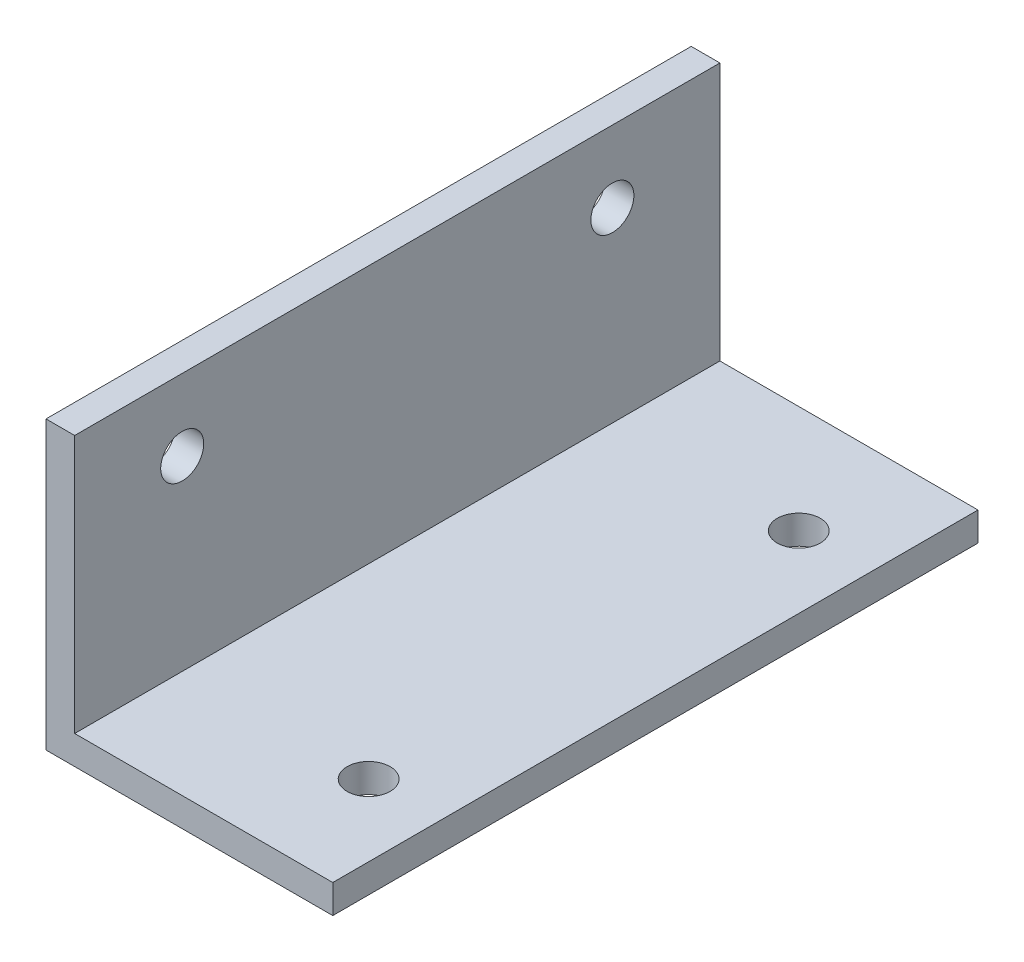
ISO-10303-21;
HEADER;
FILE_DESCRIPTION(('STEP AP214'),'2;1');
FILE_NAME('part.step','',(''),(''),'','','');
FILE_SCHEMA(('AUTOMOTIVE_DESIGN { 1 0 10303 214 1 1 1 1 }'));
ENDSEC;
DATA;
#1=APPLICATION_CONTEXT('core data for automotive mechanical design processes');
#2=APPLICATION_PROTOCOL_DEFINITION('international standard','automotive_design',2000,#1);
#3=PRODUCT_CONTEXT('',#1,'mechanical');
#4=PRODUCT('Part','Part','',(#3));
#5=PRODUCT_RELATED_PRODUCT_CATEGORY('part','',(#4));
#6=PRODUCT_DEFINITION_FORMATION('','',#4);
#7=PRODUCT_DEFINITION_CONTEXT('part definition',#1,'design');
#8=PRODUCT_DEFINITION('design','',#6,#7);
#9=PRODUCT_DEFINITION_SHAPE('','',#8);
#10=(LENGTH_UNIT() NAMED_UNIT(*) SI_UNIT(.MILLI.,.METRE.));
#11=(NAMED_UNIT(*) PLANE_ANGLE_UNIT() SI_UNIT($,.RADIAN.));
#12=(NAMED_UNIT(*) SI_UNIT($,.STERADIAN.) SOLID_ANGLE_UNIT());
#13=UNCERTAINTY_MEASURE_WITH_UNIT(LENGTH_MEASURE(1.E-05),#10,'distance_accuracy_value','');
#14=(GEOMETRIC_REPRESENTATION_CONTEXT(3) GLOBAL_UNCERTAINTY_ASSIGNED_CONTEXT((#13)) GLOBAL_UNIT_ASSIGNED_CONTEXT((#10,
#11,#12)) REPRESENTATION_CONTEXT('',''));
#15=CARTESIAN_POINT('',(0.,0.,0.));
#16=DIRECTION('',(0.,0.,1.));
#17=DIRECTION('',(1.,0.,0.));
#18=AXIS2_PLACEMENT_3D('',#15,#16,#17);
#19=CARTESIAN_POINT('',(18.,0.,45.));
#20=DIRECTION('',(0.,-1.,0.));
#21=DIRECTION('',(1.,0.,0.));
#22=AXIS2_PLACEMENT_3D('',#19,#20,#21);
#23=PLANE('',#22);
#24=CARTESIAN_POINT('',(13.,0.,37.5));
#25=DIRECTION('',(0.,1.,0.));
#26=DIRECTION('',(-1.,0.,0.));
#27=AXIS2_PLACEMENT_3D('',#24,#25,#26);
#28=CIRCLE('',#27,1.5);
#29=CARTESIAN_POINT('',(11.5,0.,37.5));
#30=VERTEX_POINT('',#29);
#31=EDGE_CURVE('E183',#30,#30,#28,.T.);
#32=ORIENTED_EDGE('',*,*,#31,.F.);
#33=EDGE_LOOP('',(#32));
#34=FACE_BOUND('',#33,.T.);
#35=CARTESIAN_POINT('',(13.,0.,7.5));
#36=DIRECTION('',(0.,1.,0.));
#37=DIRECTION('',(1.,0.,0.));
#38=AXIS2_PLACEMENT_3D('',#35,#36,#37);
#39=CIRCLE('',#38,1.5);
#40=CARTESIAN_POINT('',(14.5,0.,7.5));
#41=VERTEX_POINT('',#40);
#42=EDGE_CURVE('E186',#41,#41,#39,.T.);
#43=ORIENTED_EDGE('',*,*,#42,.F.);
#44=EDGE_LOOP('',(#43));
#45=FACE_BOUND('',#44,.T.);
#46=DIRECTION('',(-1.,0.,0.));
#47=VECTOR('',#46,1.);
#48=CARTESIAN_POINT('',(18.,0.,0.));
#49=LINE('',#48,#47);
#50=CARTESIAN_POINT('',(18.,0.,0.));
#51=VERTEX_POINT('',#50);
#52=CARTESIAN_POINT('',(0.,0.,0.));
#53=VERTEX_POINT('',#52);
#54=EDGE_CURVE('E128',#51,#53,#49,.T.);
#55=ORIENTED_EDGE('',*,*,#54,.T.);
#56=DIRECTION('',(0.,0.,-1.));
#57=VECTOR('',#56,1.);
#58=CARTESIAN_POINT('',(0.,0.,45.));
#59=LINE('',#58,#57);
#60=CARTESIAN_POINT('',(0.,0.,45.));
#61=VERTEX_POINT('',#60);
#62=EDGE_CURVE('E11',#61,#53,#59,.T.);
#63=ORIENTED_EDGE('',*,*,#62,.F.);
#64=DIRECTION('',(-1.,0.,0.));
#65=VECTOR('',#64,1.);
#66=CARTESIAN_POINT('',(18.,0.,45.));
#67=LINE('',#66,#65);
#68=CARTESIAN_POINT('',(18.,0.,45.));
#69=VERTEX_POINT('',#68);
#70=EDGE_CURVE('E145',#69,#61,#67,.T.);
#71=ORIENTED_EDGE('',*,*,#70,.F.);
#72=DIRECTION('',(0.,0.,-1.));
#73=VECTOR('',#72,1.);
#74=CARTESIAN_POINT('',(18.,0.,45.));
#75=LINE('',#74,#73);
#76=EDGE_CURVE('E124',#69,#51,#75,.T.);
#77=ORIENTED_EDGE('',*,*,#76,.T.);
#78=EDGE_LOOP('',(#55,#63,#71,#77));
#79=FACE_BOUND('',#78,.T.);
#80=ADVANCED_FACE('F39',(#34,#45,#79),#23,.F.);
#81=CARTESIAN_POINT('',(0.,0.,45.));
#82=DIRECTION('',(-1.,0.,0.));
#83=DIRECTION('',(0.,0.,1.));
#84=AXIS2_PLACEMENT_3D('',#81,#82,#83);
#85=PLANE('',#84);
#86=CARTESIAN_POINT('',(0.,13.,37.5));
#87=DIRECTION('',(1.,0.,0.));
#88=DIRECTION('',(0.,0.,-1.));
#89=AXIS2_PLACEMENT_3D('',#86,#87,#88);
#90=CIRCLE('',#89,1.5);
#91=CARTESIAN_POINT('',(0.,13.,36.));
#92=VERTEX_POINT('',#91);
#93=EDGE_CURVE('E199',#92,#92,#90,.T.);
#94=ORIENTED_EDGE('',*,*,#93,.F.);
#95=EDGE_LOOP('',(#94));
#96=FACE_BOUND('',#95,.T.);
#97=CARTESIAN_POINT('',(0.,13.,7.5));
#98=DIRECTION('',(1.,0.,0.));
#99=DIRECTION('',(0.,0.,1.));
#100=AXIS2_PLACEMENT_3D('',#97,#98,#99);
#101=CIRCLE('',#100,1.5);
#102=CARTESIAN_POINT('',(0.,13.,9.00000000000001));
#103=VERTEX_POINT('',#102);
#104=EDGE_CURVE('E207',#103,#103,#101,.T.);
#105=ORIENTED_EDGE('',*,*,#104,.F.);
#106=EDGE_LOOP('',(#105));
#107=FACE_BOUND('',#106,.T.);
#108=DIRECTION('',(0.,1.,0.));
#109=VECTOR('',#108,1.);
#110=CARTESIAN_POINT('',(0.,0.,0.));
#111=LINE('',#110,#109);
#112=CARTESIAN_POINT('',(0.,18.,0.));
#113=VERTEX_POINT('',#112);
#114=EDGE_CURVE('E132',#53,#113,#111,.T.);
#115=ORIENTED_EDGE('',*,*,#114,.T.);
#116=DIRECTION('',(0.,0.,-1.));
#117=VECTOR('',#116,1.);
#118=CARTESIAN_POINT('',(0.,18.,45.));
#119=LINE('',#118,#117);
#120=CARTESIAN_POINT('',(0.,18.,45.));
#121=VERTEX_POINT('',#120);
#122=EDGE_CURVE('E48',#121,#113,#119,.T.);
#123=ORIENTED_EDGE('',*,*,#122,.F.);
#124=DIRECTION('',(0.,1.,0.));
#125=VECTOR('',#124,1.);
#126=CARTESIAN_POINT('',(0.,0.,45.));
#127=LINE('',#126,#125);
#128=EDGE_CURVE('E93',#61,#121,#127,.T.);
#129=ORIENTED_EDGE('',*,*,#128,.F.);
#130=ORIENTED_EDGE('',*,*,#62,.T.);
#131=EDGE_LOOP('',(#115,#123,#129,#130));
#132=FACE_BOUND('',#131,.T.);
#133=ADVANCED_FACE('F174',(#96,#107,#132),#85,.F.);
#134=CARTESIAN_POINT('',(0.,18.,45.));
#135=DIRECTION('',(0.,-1.,0.));
#136=DIRECTION('',(0.,0.,-1.));
#137=AXIS2_PLACEMENT_3D('',#134,#135,#136);
#138=PLANE('',#137);
#139=DIRECTION('',(-1.,0.,0.));
#140=VECTOR('',#139,1.);
#141=CARTESIAN_POINT('',(0.,18.,0.));
#142=LINE('',#141,#140);
#143=CARTESIAN_POINT('',(-2.,18.,0.));
#144=VERTEX_POINT('',#143);
#145=EDGE_CURVE('E136',#113,#144,#142,.T.);
#146=ORIENTED_EDGE('',*,*,#145,.T.);
#147=DIRECTION('',(0.,0.,-1.));
#148=VECTOR('',#147,1.);
#149=CARTESIAN_POINT('',(-2.,18.,45.));
#150=LINE('',#149,#148);
#151=CARTESIAN_POINT('',(-2.,18.,45.));
#152=VERTEX_POINT('',#151);
#153=EDGE_CURVE('E117',#152,#144,#150,.T.);
#154=ORIENTED_EDGE('',*,*,#153,.F.);
#155=DIRECTION('',(-1.,0.,0.));
#156=VECTOR('',#155,1.);
#157=CARTESIAN_POINT('',(0.,18.,45.));
#158=LINE('',#157,#156);
#159=EDGE_CURVE('E106',#121,#152,#158,.T.);
#160=ORIENTED_EDGE('',*,*,#159,.F.);
#161=ORIENTED_EDGE('',*,*,#122,.T.);
#162=EDGE_LOOP('',(#146,#154,#160,#161));
#163=FACE_BOUND('',#162,.T.);
#164=ADVANCED_FACE('F155',(#163),#138,.F.);
#165=CARTESIAN_POINT('',(-2.,18.,45.));
#166=DIRECTION('',(1.,0.,0.));
#167=DIRECTION('',(0.,1.,0.));
#168=AXIS2_PLACEMENT_3D('',#165,#166,#167);
#169=PLANE('',#168);
#170=CARTESIAN_POINT('',(-2.,13.,37.5));
#171=DIRECTION('',(1.,0.,0.));
#172=DIRECTION('',(0.,0.,-1.));
#173=AXIS2_PLACEMENT_3D('',#170,#171,#172);
#174=CIRCLE('',#173,1.5);
#175=CARTESIAN_POINT('',(-2.,13.,36.));
#176=VERTEX_POINT('',#175);
#177=EDGE_CURVE('E133',#176,#176,#174,.T.);
#178=ORIENTED_EDGE('',*,*,#177,.T.);
#179=EDGE_LOOP('',(#178));
#180=FACE_BOUND('',#179,.T.);
#181=CARTESIAN_POINT('',(-2.,13.,7.5));
#182=DIRECTION('',(1.,0.,0.));
#183=DIRECTION('',(0.,0.,1.));
#184=AXIS2_PLACEMENT_3D('',#181,#182,#183);
#185=CIRCLE('',#184,1.5);
#186=CARTESIAN_POINT('',(-2.,13.,9.00000000000001));
#187=VERTEX_POINT('',#186);
#188=EDGE_CURVE('E203',#187,#187,#185,.T.);
#189=ORIENTED_EDGE('',*,*,#188,.T.);
#190=EDGE_LOOP('',(#189));
#191=FACE_BOUND('',#190,.T.);
#192=DIRECTION('',(0.,-1.,0.));
#193=VECTOR('',#192,1.);
#194=CARTESIAN_POINT('',(-2.,18.,0.));
#195=LINE('',#194,#193);
#196=CARTESIAN_POINT('',(-2.,-2.,0.));
#197=VERTEX_POINT('',#196);
#198=EDGE_CURVE('E115',#144,#197,#195,.T.);
#199=ORIENTED_EDGE('',*,*,#198,.T.);
#200=DIRECTION('',(0.,0.,-1.));
#201=VECTOR('',#200,1.);
#202=CARTESIAN_POINT('',(-2.,-2.,45.));
#203=LINE('',#202,#201);
#204=CARTESIAN_POINT('',(-2.,-2.,45.));
#205=VERTEX_POINT('',#204);
#206=EDGE_CURVE('E112',#205,#197,#203,.T.);
#207=ORIENTED_EDGE('',*,*,#206,.F.);
#208=DIRECTION('',(0.,-1.,0.));
#209=VECTOR('',#208,1.);
#210=CARTESIAN_POINT('',(-2.,18.,45.));
#211=LINE('',#210,#209);
#212=EDGE_CURVE('E100',#152,#205,#211,.T.);
#213=ORIENTED_EDGE('',*,*,#212,.F.);
#214=ORIENTED_EDGE('',*,*,#153,.T.);
#215=EDGE_LOOP('',(#199,#207,#213,#214));
#216=FACE_BOUND('',#215,.T.);
#217=ADVANCED_FACE('F113',(#180,#191,#216),#169,.F.);
#218=CARTESIAN_POINT('',(-2.,-2.,45.));
#219=DIRECTION('',(0.,1.,0.));
#220=DIRECTION('',(-1.,0.,0.));
#221=AXIS2_PLACEMENT_3D('',#218,#219,#220);
#222=PLANE('',#221);
#223=CARTESIAN_POINT('',(13.,-2.,37.5));
#224=DIRECTION('',(0.,1.,0.));
#225=DIRECTION('',(-1.,0.,0.));
#226=AXIS2_PLACEMENT_3D('',#223,#224,#225);
#227=CIRCLE('',#226,1.5);
#228=CARTESIAN_POINT('',(11.5,-2.,37.5));
#229=VERTEX_POINT('',#228);
#230=EDGE_CURVE('E211',#229,#229,#227,.T.);
#231=ORIENTED_EDGE('',*,*,#230,.T.);
#232=EDGE_LOOP('',(#231));
#233=FACE_BOUND('',#232,.T.);
#234=CARTESIAN_POINT('',(13.,-2.,7.5));
#235=DIRECTION('',(0.,1.,0.));
#236=DIRECTION('',(1.,0.,0.));
#237=AXIS2_PLACEMENT_3D('',#234,#235,#236);
#238=CIRCLE('',#237,1.5);
#239=CARTESIAN_POINT('',(14.5,-2.,7.5));
#240=VERTEX_POINT('',#239);
#241=EDGE_CURVE('E189',#240,#240,#238,.T.);
#242=ORIENTED_EDGE('',*,*,#241,.T.);
#243=EDGE_LOOP('',(#242));
#244=FACE_BOUND('',#243,.T.);
#245=DIRECTION('',(1.,0.,0.));
#246=VECTOR('',#245,1.);
#247=CARTESIAN_POINT('',(-2.,-2.,0.));
#248=LINE('',#247,#246);
#249=CARTESIAN_POINT('',(18.,-2.,0.));
#250=VERTEX_POINT('',#249);
#251=EDGE_CURVE('E79',#197,#250,#248,.T.);
#252=ORIENTED_EDGE('',*,*,#251,.T.);
#253=DIRECTION('',(0.,0.,-1.));
#254=VECTOR('',#253,1.);
#255=CARTESIAN_POINT('',(18.,-2.,45.));
#256=LINE('',#255,#254);
#257=CARTESIAN_POINT('',(18.,-2.,45.));
#258=VERTEX_POINT('',#257);
#259=EDGE_CURVE('E118',#258,#250,#256,.T.);
#260=ORIENTED_EDGE('',*,*,#259,.F.);
#261=DIRECTION('',(1.,0.,0.));
#262=VECTOR('',#261,1.);
#263=CARTESIAN_POINT('',(-2.,-2.,45.));
#264=LINE('',#263,#262);
#265=EDGE_CURVE('E104',#205,#258,#264,.T.);
#266=ORIENTED_EDGE('',*,*,#265,.F.);
#267=ORIENTED_EDGE('',*,*,#206,.T.);
#268=EDGE_LOOP('',(#252,#260,#266,#267));
#269=FACE_BOUND('',#268,.T.);
#270=ADVANCED_FACE('F120',(#233,#244,#269),#222,.F.);
#271=CARTESIAN_POINT('',(18.,-2.,45.));
#272=DIRECTION('',(-1.,0.,0.));
#273=DIRECTION('',(0.,0.,1.));
#274=AXIS2_PLACEMENT_3D('',#271,#272,#273);
#275=PLANE('',#274);
#276=DIRECTION('',(0.,1.,0.));
#277=VECTOR('',#276,1.);
#278=CARTESIAN_POINT('',(18.,-2.,0.));
#279=LINE('',#278,#277);
#280=EDGE_CURVE('E85',#250,#51,#279,.T.);
#281=ORIENTED_EDGE('',*,*,#280,.T.);
#282=ORIENTED_EDGE('',*,*,#76,.F.);
#283=DIRECTION('',(0.,1.,0.));
#284=VECTOR('',#283,1.);
#285=CARTESIAN_POINT('',(18.,-2.,45.));
#286=LINE('',#285,#284);
#287=EDGE_CURVE('E56',#258,#69,#286,.T.);
#288=ORIENTED_EDGE('',*,*,#287,.F.);
#289=ORIENTED_EDGE('',*,*,#259,.T.);
#290=EDGE_LOOP('',(#281,#282,#288,#289));
#291=FACE_BOUND('',#290,.T.);
#292=ADVANCED_FACE('F162',(#291),#275,.F.);
#293=CARTESIAN_POINT('',(0.,0.,45.));
#294=DIRECTION('',(0.,0.,-1.));
#295=DIRECTION('',(-1.,0.,0.));
#296=AXIS2_PLACEMENT_3D('',#293,#294,#295);
#297=PLANE('',#296);
#298=ORIENTED_EDGE('',*,*,#70,.T.);
#299=ORIENTED_EDGE('',*,*,#128,.T.);
#300=ORIENTED_EDGE('',*,*,#159,.T.);
#301=ORIENTED_EDGE('',*,*,#212,.T.);
#302=ORIENTED_EDGE('',*,*,#265,.T.);
#303=ORIENTED_EDGE('',*,*,#287,.T.);
#304=EDGE_LOOP('',(#298,#299,#300,#301,#302,#303));
#305=FACE_BOUND('',#304,.T.);
#306=ADVANCED_FACE('F102',(#305),#297,.F.);
#307=CARTESIAN_POINT('',(0.,0.,0.));
#308=DIRECTION('',(0.,0.,-1.));
#309=DIRECTION('',(-1.,0.,0.));
#310=AXIS2_PLACEMENT_3D('',#307,#308,#309);
#311=PLANE('',#310);
#312=ORIENTED_EDGE('',*,*,#54,.F.);
#313=ORIENTED_EDGE('',*,*,#280,.F.);
#314=ORIENTED_EDGE('',*,*,#251,.F.);
#315=ORIENTED_EDGE('',*,*,#198,.F.);
#316=ORIENTED_EDGE('',*,*,#145,.F.);
#317=ORIENTED_EDGE('',*,*,#114,.F.);
#318=EDGE_LOOP('',(#312,#313,#314,#315,#316,#317));
#319=FACE_BOUND('',#318,.T.);
#320=ADVANCED_FACE('F158',(#319),#311,.T.);
#321=CARTESIAN_POINT('',(-2.,13.,7.5));
#322=DIRECTION('',(1.,0.,0.));
#323=DIRECTION('',(0.,0.,-1.));
#324=AXIS2_PLACEMENT_3D('',#321,#322,#323);
#325=CYLINDRICAL_SURFACE('',#324,1.5);
#326=ORIENTED_EDGE('',*,*,#188,.F.);
#327=EDGE_LOOP('',(#326));
#328=FACE_BOUND('',#327,.T.);
#329=ORIENTED_EDGE('',*,*,#104,.T.);
#330=EDGE_LOOP('',(#329));
#331=FACE_BOUND('',#330,.T.);
#332=ADVANCED_FACE('F236',(#328,#331),#325,.F.);
#333=CARTESIAN_POINT('',(-2.,13.,37.5));
#334=DIRECTION('',(1.,0.,0.));
#335=DIRECTION('',(0.,0.,-1.));
#336=AXIS2_PLACEMENT_3D('',#333,#334,#335);
#337=CYLINDRICAL_SURFACE('',#336,1.5);
#338=ORIENTED_EDGE('',*,*,#177,.F.);
#339=EDGE_LOOP('',(#338));
#340=FACE_BOUND('',#339,.T.);
#341=ORIENTED_EDGE('',*,*,#93,.T.);
#342=EDGE_LOOP('',(#341));
#343=FACE_BOUND('',#342,.T.);
#344=ADVANCED_FACE('F229',(#340,#343),#337,.F.);
#345=CARTESIAN_POINT('',(13.,-2.,7.5));
#346=DIRECTION('',(0.,1.,0.));
#347=DIRECTION('',(-1.,0.,0.));
#348=AXIS2_PLACEMENT_3D('',#345,#346,#347);
#349=CYLINDRICAL_SURFACE('',#348,1.5);
#350=ORIENTED_EDGE('',*,*,#241,.F.);
#351=EDGE_LOOP('',(#350));
#352=FACE_BOUND('',#351,.T.);
#353=ORIENTED_EDGE('',*,*,#42,.T.);
#354=EDGE_LOOP('',(#353));
#355=FACE_BOUND('',#354,.T.);
#356=ADVANCED_FACE('F223',(#352,#355),#349,.F.);
#357=CARTESIAN_POINT('',(13.,-2.,37.5));
#358=DIRECTION('',(0.,1.,0.));
#359=DIRECTION('',(-1.,0.,0.));
#360=AXIS2_PLACEMENT_3D('',#357,#358,#359);
#361=CYLINDRICAL_SURFACE('',#360,1.5);
#362=ORIENTED_EDGE('',*,*,#230,.F.);
#363=EDGE_LOOP('',(#362));
#364=FACE_BOUND('',#363,.T.);
#365=ORIENTED_EDGE('',*,*,#31,.T.);
#366=EDGE_LOOP('',(#365));
#367=FACE_BOUND('',#366,.T.);
#368=ADVANCED_FACE('F221',(#364,#367),#361,.F.);
#369=CLOSED_SHELL('',(#80,#133,#164,#217,#270,#292,#306,#320,#332,#344,#356,#368));
#370=MANIFOLD_SOLID_BREP('B2',#369);
#371=ADVANCED_BREP_SHAPE_REPRESENTATION('',(#18,#370),#14);
#372=SHAPE_DEFINITION_REPRESENTATION(#9,#371);
ENDSEC;
END-ISO-10303-21;
